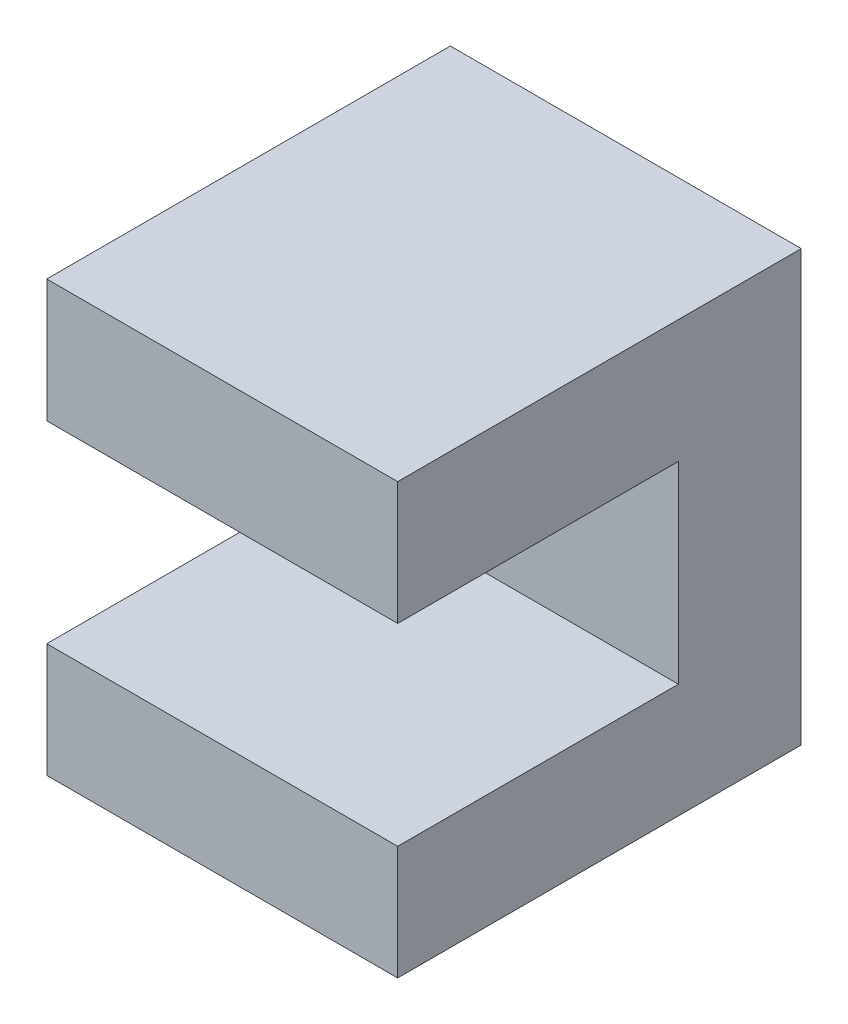
ISO-10303-21;
HEADER;
FILE_DESCRIPTION(('STEP AP214'),'2;1');
FILE_NAME('part.step','',(''),(''),'','','');
FILE_SCHEMA(('AUTOMOTIVE_DESIGN { 1 0 10303 214 1 1 1 1 }'));
ENDSEC;
DATA;
#1=APPLICATION_CONTEXT('core data for automotive mechanical design processes');
#2=APPLICATION_PROTOCOL_DEFINITION('international standard','automotive_design',2000,#1);
#3=PRODUCT_CONTEXT('',#1,'mechanical');
#4=PRODUCT('Part','Part','',(#3));
#5=PRODUCT_RELATED_PRODUCT_CATEGORY('part','',(#4));
#6=PRODUCT_DEFINITION_FORMATION('','',#4);
#7=PRODUCT_DEFINITION_CONTEXT('part definition',#1,'design');
#8=PRODUCT_DEFINITION('design','',#6,#7);
#9=PRODUCT_DEFINITION_SHAPE('','',#8);
#10=(LENGTH_UNIT() NAMED_UNIT(*) SI_UNIT(.MILLI.,.METRE.));
#11=(NAMED_UNIT(*) PLANE_ANGLE_UNIT() SI_UNIT($,.RADIAN.));
#12=(NAMED_UNIT(*) SI_UNIT($,.STERADIAN.) SOLID_ANGLE_UNIT());
#13=UNCERTAINTY_MEASURE_WITH_UNIT(LENGTH_MEASURE(1.E-05),#10,'distance_accuracy_value','');
#14=(GEOMETRIC_REPRESENTATION_CONTEXT(3) GLOBAL_UNCERTAINTY_ASSIGNED_CONTEXT((#13)) GLOBAL_UNIT_ASSIGNED_CONTEXT((#10,
#11,#12)) REPRESENTATION_CONTEXT('',''));
#15=CARTESIAN_POINT('',(0.,0.,0.));
#16=DIRECTION('',(0.,0.,1.));
#17=DIRECTION('',(1.,0.,0.));
#18=AXIS2_PLACEMENT_3D('',#15,#16,#17);
#19=CARTESIAN_POINT('',(20.,0.,7.));
#20=DIRECTION('',(0.,0.,1.));
#21=DIRECTION('',(1.,0.,0.));
#22=AXIS2_PLACEMENT_3D('',#19,#20,#21);
#23=PLANE('',#22);
#24=DIRECTION('',(0.,1.,0.));
#25=VECTOR('',#24,1.);
#26=CARTESIAN_POINT('',(0.,0.,7.));
#27=LINE('',#26,#25);
#28=CARTESIAN_POINT('',(0.,6.5,7.));
#29=VERTEX_POINT('',#28);
#30=CARTESIAN_POINT('',(0.,17.5,7.));
#31=VERTEX_POINT('',#30);
#32=EDGE_CURVE('E149',#29,#31,#27,.T.);
#33=ORIENTED_EDGE('',*,*,#32,.F.);
#34=DIRECTION('',(-1.,0.,0.));
#35=VECTOR('',#34,1.);
#36=CARTESIAN_POINT('',(20.,6.5,7.));
#37=LINE('',#36,#35);
#38=CARTESIAN_POINT('',(20.,6.5,7.));
#39=VERTEX_POINT('',#38);
#40=EDGE_CURVE('E11',#39,#29,#37,.T.);
#41=ORIENTED_EDGE('',*,*,#40,.F.);
#42=DIRECTION('',(0.,1.,0.));
#43=VECTOR('',#42,1.);
#44=CARTESIAN_POINT('',(20.,0.,7.));
#45=LINE('',#44,#43);
#46=CARTESIAN_POINT('',(20.,17.5,7.));
#47=VERTEX_POINT('',#46);
#48=EDGE_CURVE('E176',#39,#47,#45,.T.);
#49=ORIENTED_EDGE('',*,*,#48,.T.);
#50=DIRECTION('',(-1.,0.,0.));
#51=VECTOR('',#50,1.);
#52=CARTESIAN_POINT('',(20.,17.5,7.));
#53=LINE('',#52,#51);
#54=EDGE_CURVE('E66',#47,#31,#53,.T.);
#55=ORIENTED_EDGE('',*,*,#54,.T.);
#56=EDGE_LOOP('',(#33,#41,#49,#55));
#57=FACE_BOUND('',#56,.T.);
#58=ADVANCED_FACE('F49',(#57),#23,.T.);
#59=CARTESIAN_POINT('',(20.,6.5,0.));
#60=DIRECTION('',(0.,-1.,0.));
#61=DIRECTION('',(0.,0.,-1.));
#62=AXIS2_PLACEMENT_3D('',#59,#60,#61);
#63=PLANE('',#62);
#64=DIRECTION('',(0.,0.,1.));
#65=VECTOR('',#64,1.);
#66=CARTESIAN_POINT('',(0.,6.5,0.));
#67=LINE('',#66,#65);
#68=CARTESIAN_POINT('',(0.,6.5,23.));
#69=VERTEX_POINT('',#68);
#70=EDGE_CURVE('E152',#29,#69,#67,.T.);
#71=ORIENTED_EDGE('',*,*,#70,.T.);
#72=DIRECTION('',(-1.,0.,0.));
#73=VECTOR('',#72,1.);
#74=CARTESIAN_POINT('',(20.,6.5,23.));
#75=LINE('',#74,#73);
#76=CARTESIAN_POINT('',(20.,6.5,23.));
#77=VERTEX_POINT('',#76);
#78=EDGE_CURVE('E58',#77,#69,#75,.T.);
#79=ORIENTED_EDGE('',*,*,#78,.F.);
#80=DIRECTION('',(0.,0.,1.));
#81=VECTOR('',#80,1.);
#82=CARTESIAN_POINT('',(20.,6.5,0.));
#83=LINE('',#82,#81);
#84=EDGE_CURVE('E207',#39,#77,#83,.T.);
#85=ORIENTED_EDGE('',*,*,#84,.F.);
#86=ORIENTED_EDGE('',*,*,#40,.T.);
#87=EDGE_LOOP('',(#71,#79,#85,#86));
#88=FACE_BOUND('',#87,.T.);
#89=ADVANCED_FACE('F198',(#88),#63,.F.);
#90=CARTESIAN_POINT('',(20.,0.,23.));
#91=DIRECTION('',(0.,0.,1.));
#92=DIRECTION('',(1.,0.,0.));
#93=AXIS2_PLACEMENT_3D('',#90,#91,#92);
#94=PLANE('',#93);
#95=DIRECTION('',(0.,1.,0.));
#96=VECTOR('',#95,1.);
#97=CARTESIAN_POINT('',(0.,0.,23.));
#98=LINE('',#97,#96);
#99=CARTESIAN_POINT('',(0.,0.,23.));
#100=VERTEX_POINT('',#99);
#101=EDGE_CURVE('E156',#100,#69,#98,.T.);
#102=ORIENTED_EDGE('',*,*,#101,.F.);
#103=DIRECTION('',(-1.,0.,0.));
#104=VECTOR('',#103,1.);
#105=CARTESIAN_POINT('',(20.,0.,23.));
#106=LINE('',#105,#104);
#107=CARTESIAN_POINT('',(20.,0.,23.));
#108=VERTEX_POINT('',#107);
#109=EDGE_CURVE('E186',#108,#100,#106,.T.);
#110=ORIENTED_EDGE('',*,*,#109,.F.);
#111=DIRECTION('',(0.,1.,0.));
#112=VECTOR('',#111,1.);
#113=CARTESIAN_POINT('',(20.,0.,23.));
#114=LINE('',#113,#112);
#115=EDGE_CURVE('E195',#108,#77,#114,.T.);
#116=ORIENTED_EDGE('',*,*,#115,.T.);
#117=ORIENTED_EDGE('',*,*,#78,.T.);
#118=EDGE_LOOP('',(#102,#110,#116,#117));
#119=FACE_BOUND('',#118,.T.);
#120=ADVANCED_FACE('F193',(#119),#94,.T.);
#121=CARTESIAN_POINT('',(20.,0.,0.));
#122=DIRECTION('',(0.,-1.,0.));
#123=DIRECTION('',(0.,0.,-1.));
#124=AXIS2_PLACEMENT_3D('',#121,#122,#123);
#125=PLANE('',#124);
#126=DIRECTION('',(0.,0.,1.));
#127=VECTOR('',#126,1.);
#128=CARTESIAN_POINT('',(0.,0.,0.));
#129=LINE('',#128,#127);
#130=CARTESIAN_POINT('',(0.,0.,0.));
#131=VERTEX_POINT('',#130);
#132=EDGE_CURVE('E160',#131,#100,#129,.T.);
#133=ORIENTED_EDGE('',*,*,#132,.F.);
#134=DIRECTION('',(-1.,0.,0.));
#135=VECTOR('',#134,1.);
#136=CARTESIAN_POINT('',(20.,0.,0.));
#137=LINE('',#136,#135);
#138=CARTESIAN_POINT('',(20.,0.,0.));
#139=VERTEX_POINT('',#138);
#140=EDGE_CURVE('E183',#139,#131,#137,.T.);
#141=ORIENTED_EDGE('',*,*,#140,.F.);
#142=DIRECTION('',(0.,0.,1.));
#143=VECTOR('',#142,1.);
#144=CARTESIAN_POINT('',(20.,0.,0.));
#145=LINE('',#144,#143);
#146=EDGE_CURVE('E206',#139,#108,#145,.T.);
#147=ORIENTED_EDGE('',*,*,#146,.T.);
#148=ORIENTED_EDGE('',*,*,#109,.T.);
#149=EDGE_LOOP('',(#133,#141,#147,#148));
#150=FACE_BOUND('',#149,.T.);
#151=ADVANCED_FACE('F204',(#150),#125,.T.);
#152=CARTESIAN_POINT('',(20.,0.,0.));
#153=DIRECTION('',(0.,0.,1.));
#154=DIRECTION('',(1.,0.,0.));
#155=AXIS2_PLACEMENT_3D('',#152,#153,#154);
#156=PLANE('',#155);
#157=DIRECTION('',(0.,1.,0.));
#158=VECTOR('',#157,1.);
#159=CARTESIAN_POINT('',(0.,0.,0.));
#160=LINE('',#159,#158);
#161=CARTESIAN_POINT('',(0.,24.5,0.));
#162=VERTEX_POINT('',#161);
#163=EDGE_CURVE('E164',#131,#162,#160,.T.);
#164=ORIENTED_EDGE('',*,*,#163,.T.);
#165=DIRECTION('',(-1.,0.,0.));
#166=VECTOR('',#165,1.);
#167=CARTESIAN_POINT('',(20.,24.5,0.));
#168=LINE('',#167,#166);
#169=CARTESIAN_POINT('',(20.,24.5,0.));
#170=VERTEX_POINT('',#169);
#171=EDGE_CURVE('E139',#170,#162,#168,.T.);
#172=ORIENTED_EDGE('',*,*,#171,.F.);
#173=DIRECTION('',(0.,1.,0.));
#174=VECTOR('',#173,1.);
#175=CARTESIAN_POINT('',(20.,0.,0.));
#176=LINE('',#175,#174);
#177=EDGE_CURVE('E125',#139,#170,#176,.T.);
#178=ORIENTED_EDGE('',*,*,#177,.F.);
#179=ORIENTED_EDGE('',*,*,#140,.T.);
#180=EDGE_LOOP('',(#164,#172,#178,#179));
#181=FACE_BOUND('',#180,.T.);
#182=ADVANCED_FACE('F238',(#181),#156,.F.);
#183=CARTESIAN_POINT('',(20.,24.5,0.));
#184=DIRECTION('',(0.,-1.,0.));
#185=DIRECTION('',(0.,0.,-1.));
#186=AXIS2_PLACEMENT_3D('',#183,#184,#185);
#187=PLANE('',#186);
#188=DIRECTION('',(0.,0.,1.));
#189=VECTOR('',#188,1.);
#190=CARTESIAN_POINT('',(0.,24.5,0.));
#191=LINE('',#190,#189);
#192=CARTESIAN_POINT('',(0.,24.5,23.));
#193=VERTEX_POINT('',#192);
#194=EDGE_CURVE('E135',#162,#193,#191,.T.);
#195=ORIENTED_EDGE('',*,*,#194,.T.);
#196=DIRECTION('',(-1.,0.,0.));
#197=VECTOR('',#196,1.);
#198=CARTESIAN_POINT('',(20.,24.5,23.));
#199=LINE('',#198,#197);
#200=CARTESIAN_POINT('',(20.,24.5,23.));
#201=VERTEX_POINT('',#200);
#202=EDGE_CURVE('E132',#201,#193,#199,.T.);
#203=ORIENTED_EDGE('',*,*,#202,.F.);
#204=DIRECTION('',(0.,0.,1.));
#205=VECTOR('',#204,1.);
#206=CARTESIAN_POINT('',(20.,24.5,0.));
#207=LINE('',#206,#205);
#208=EDGE_CURVE('E116',#170,#201,#207,.T.);
#209=ORIENTED_EDGE('',*,*,#208,.F.);
#210=ORIENTED_EDGE('',*,*,#171,.T.);
#211=EDGE_LOOP('',(#195,#203,#209,#210));
#212=FACE_BOUND('',#211,.T.);
#213=ADVANCED_FACE('F133',(#212),#187,.F.);
#214=CARTESIAN_POINT('',(20.,0.,23.));
#215=DIRECTION('',(0.,0.,1.));
#216=DIRECTION('',(0.,-1.,0.));
#217=AXIS2_PLACEMENT_3D('',#214,#215,#216);
#218=PLANE('',#217);
#219=DIRECTION('',(0.,1.,0.));
#220=VECTOR('',#219,1.);
#221=CARTESIAN_POINT('',(0.,0.,23.));
#222=LINE('',#221,#220);
#223=CARTESIAN_POINT('',(0.,17.5,23.));
#224=VERTEX_POINT('',#223);
#225=EDGE_CURVE('E169',#224,#193,#222,.T.);
#226=ORIENTED_EDGE('',*,*,#225,.F.);
#227=DIRECTION('',(-1.,0.,0.));
#228=VECTOR('',#227,1.);
#229=CARTESIAN_POINT('',(20.,17.5,23.));
#230=LINE('',#229,#228);
#231=CARTESIAN_POINT('',(20.,17.5,23.));
#232=VERTEX_POINT('',#231);
#233=EDGE_CURVE('E91',#232,#224,#230,.T.);
#234=ORIENTED_EDGE('',*,*,#233,.F.);
#235=DIRECTION('',(0.,1.,0.));
#236=VECTOR('',#235,1.);
#237=CARTESIAN_POINT('',(20.,0.,23.));
#238=LINE('',#237,#236);
#239=EDGE_CURVE('E122',#232,#201,#238,.T.);
#240=ORIENTED_EDGE('',*,*,#239,.T.);
#241=ORIENTED_EDGE('',*,*,#202,.T.);
#242=EDGE_LOOP('',(#226,#234,#240,#241));
#243=FACE_BOUND('',#242,.T.);
#244=ADVANCED_FACE('F141',(#243),#218,.T.);
#245=CARTESIAN_POINT('',(20.,17.5,0.));
#246=DIRECTION('',(0.,-1.,0.));
#247=DIRECTION('',(0.,0.,-1.));
#248=AXIS2_PLACEMENT_3D('',#245,#246,#247);
#249=PLANE('',#248);
#250=DIRECTION('',(0.,0.,1.));
#251=VECTOR('',#250,1.);
#252=CARTESIAN_POINT('',(0.,17.5,0.));
#253=LINE('',#252,#251);
#254=EDGE_CURVE('E172',#31,#224,#253,.T.);
#255=ORIENTED_EDGE('',*,*,#254,.F.);
#256=ORIENTED_EDGE('',*,*,#54,.F.);
#257=DIRECTION('',(0.,0.,1.));
#258=VECTOR('',#257,1.);
#259=CARTESIAN_POINT('',(20.,17.5,0.));
#260=LINE('',#259,#258);
#261=EDGE_CURVE('E143',#47,#232,#260,.T.);
#262=ORIENTED_EDGE('',*,*,#261,.T.);
#263=ORIENTED_EDGE('',*,*,#233,.T.);
#264=EDGE_LOOP('',(#255,#256,#262,#263));
#265=FACE_BOUND('',#264,.T.);
#266=ADVANCED_FACE('F217',(#265),#249,.T.);
#267=CARTESIAN_POINT('',(20.,0.,0.));
#268=DIRECTION('',(1.,0.,0.));
#269=DIRECTION('',(0.,0.,-1.));
#270=AXIS2_PLACEMENT_3D('',#267,#268,#269);
#271=PLANE('',#270);
#272=ORIENTED_EDGE('',*,*,#48,.F.);
#273=ORIENTED_EDGE('',*,*,#84,.T.);
#274=ORIENTED_EDGE('',*,*,#115,.F.);
#275=ORIENTED_EDGE('',*,*,#146,.F.);
#276=ORIENTED_EDGE('',*,*,#177,.T.);
#277=ORIENTED_EDGE('',*,*,#208,.T.);
#278=ORIENTED_EDGE('',*,*,#239,.F.);
#279=ORIENTED_EDGE('',*,*,#261,.F.);
#280=EDGE_LOOP('',(#272,#273,#274,#275,#276,#277,#278,#279));
#281=FACE_BOUND('',#280,.T.);
#282=ADVANCED_FACE('F119',(#281),#271,.T.);
#283=CARTESIAN_POINT('',(0.,0.,0.));
#284=DIRECTION('',(1.,0.,0.));
#285=DIRECTION('',(0.,0.,-1.));
#286=AXIS2_PLACEMENT_3D('',#283,#284,#285);
#287=PLANE('',#286);
#288=ORIENTED_EDGE('',*,*,#32,.T.);
#289=ORIENTED_EDGE('',*,*,#254,.T.);
#290=ORIENTED_EDGE('',*,*,#225,.T.);
#291=ORIENTED_EDGE('',*,*,#194,.F.);
#292=ORIENTED_EDGE('',*,*,#163,.F.);
#293=ORIENTED_EDGE('',*,*,#132,.T.);
#294=ORIENTED_EDGE('',*,*,#101,.T.);
#295=ORIENTED_EDGE('',*,*,#70,.F.);
#296=EDGE_LOOP('',(#288,#289,#290,#291,#292,#293,#294,#295));
#297=FACE_BOUND('',#296,.T.);
#298=ADVANCED_FACE('F200',(#297),#287,.F.);
#299=CLOSED_SHELL('',(#58,#89,#120,#151,#182,#213,#244,#266,#282,#298));
#300=MANIFOLD_SOLID_BREP('B2',#299);
#301=ADVANCED_BREP_SHAPE_REPRESENTATION('',(#18,#300),#14);
#302=SHAPE_DEFINITION_REPRESENTATION(#9,#301);
ENDSEC;
END-ISO-10303-21;
